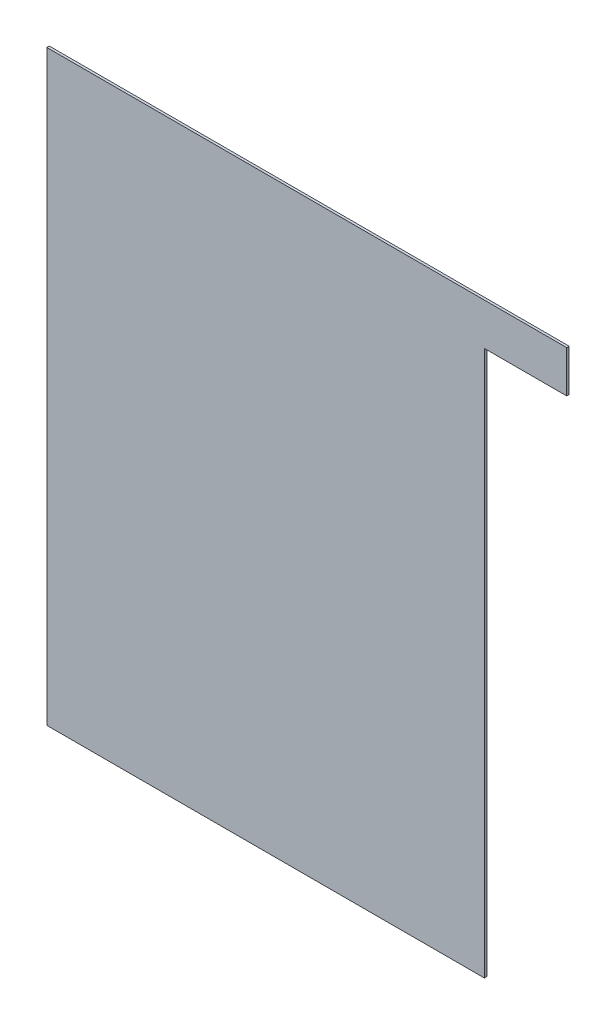
ISO-10303-21;
HEADER;
FILE_DESCRIPTION(('STEP AP214'),'2;1');
FILE_NAME('part.step','',(''),(''),'','','');
FILE_SCHEMA(('AUTOMOTIVE_DESIGN { 1 0 10303 214 1 1 1 1 }'));
ENDSEC;
DATA;
#1=APPLICATION_CONTEXT('core data for automotive mechanical design processes');
#2=APPLICATION_PROTOCOL_DEFINITION('international standard','automotive_design',2000,#1);
#3=PRODUCT_CONTEXT('',#1,'mechanical');
#4=PRODUCT('Part','Part','',(#3));
#5=PRODUCT_RELATED_PRODUCT_CATEGORY('part','',(#4));
#6=PRODUCT_DEFINITION_FORMATION('','',#4);
#7=PRODUCT_DEFINITION_CONTEXT('part definition',#1,'design');
#8=PRODUCT_DEFINITION('design','',#6,#7);
#9=PRODUCT_DEFINITION_SHAPE('','',#8);
#10=(LENGTH_UNIT() NAMED_UNIT(*) SI_UNIT(.MILLI.,.METRE.));
#11=(NAMED_UNIT(*) PLANE_ANGLE_UNIT() SI_UNIT($,.RADIAN.));
#12=(NAMED_UNIT(*) SI_UNIT($,.STERADIAN.) SOLID_ANGLE_UNIT());
#13=UNCERTAINTY_MEASURE_WITH_UNIT(LENGTH_MEASURE(1.E-05),#10,'distance_accuracy_value','');
#14=(GEOMETRIC_REPRESENTATION_CONTEXT(3) GLOBAL_UNCERTAINTY_ASSIGNED_CONTEXT((#13)) GLOBAL_UNIT_ASSIGNED_CONTEXT((#10,
#11,#12)) REPRESENTATION_CONTEXT('',''));
#15=CARTESIAN_POINT('',(0.,0.,0.));
#16=DIRECTION('',(0.,0.,1.));
#17=DIRECTION('',(1.,0.,0.));
#18=AXIS2_PLACEMENT_3D('',#15,#16,#17);
#19=CARTESIAN_POINT('',(0.,0.,2.));
#20=DIRECTION('',(0.,0.,1.));
#21=DIRECTION('',(1.,0.,0.));
#22=AXIS2_PLACEMENT_3D('',#19,#20,#21);
#23=PLANE('',#22);
#24=DIRECTION('',(0.,1.,0.));
#25=VECTOR('',#24,1.);
#26=CARTESIAN_POINT('',(890.,297.7,2.00000000000011));
#27=LINE('',#26,#25);
#28=CARTESIAN_POINT('',(890.,348.5,2.00000000000006));
#29=VERTEX_POINT('',#28);
#30=CARTESIAN_POINT('',(890.,297.7,2.00000000000006));
#31=VERTEX_POINT('',#30);
#32=EDGE_CURVE('E92',#29,#31,#27,.F.);
#33=ORIENTED_EDGE('',*,*,#32,.T.);
#34=DIRECTION('',(-1.,0.,0.));
#35=VECTOR('',#34,1.);
#36=CARTESIAN_POINT('',(790.,297.7,2.00000000000011));
#37=LINE('',#36,#35);
#38=CARTESIAN_POINT('',(790.,297.7,2.00000000000003));
#39=VERTEX_POINT('',#38);
#40=EDGE_CURVE('E68',#31,#39,#37,.T.);
#41=ORIENTED_EDGE('',*,*,#40,.T.);
#42=DIRECTION('',(0.,1.,0.));
#43=VECTOR('',#42,1.);
#44=CARTESIAN_POINT('',(790.,338.5,2.));
#45=LINE('',#44,#43);
#46=CARTESIAN_POINT('',(790.,-364.,2.));
#47=VERTEX_POINT('',#46);
#48=EDGE_CURVE('E80',#47,#39,#45,.T.);
#49=ORIENTED_EDGE('',*,*,#48,.F.);
#50=DIRECTION('',(1.,0.,0.));
#51=VECTOR('',#50,1.);
#52=CARTESIAN_POINT('',(780.,-364.,2.));
#53=LINE('',#52,#51);
#54=CARTESIAN_POINT('',(259.,-364.,2.));
#55=VERTEX_POINT('',#54);
#56=EDGE_CURVE('E20',#55,#47,#53,.T.);
#57=ORIENTED_EDGE('',*,*,#56,.F.);
#58=DIRECTION('',(0.,1.,0.));
#59=VECTOR('',#58,1.);
#60=CARTESIAN_POINT('',(259.,-354.,2.));
#61=LINE('',#60,#59);
#62=CARTESIAN_POINT('',(259.,348.5,2.00000000000003));
#63=VERTEX_POINT('',#62);
#64=EDGE_CURVE('E101',#63,#55,#61,.F.);
#65=ORIENTED_EDGE('',*,*,#64,.F.);
#66=DIRECTION('',(-1.,0.,0.));
#67=VECTOR('',#66,1.);
#68=CARTESIAN_POINT('',(269.,348.5,2.00000000000011));
#69=LINE('',#68,#67);
#70=EDGE_CURVE('E96',#29,#63,#69,.T.);
#71=ORIENTED_EDGE('',*,*,#70,.F.);
#72=EDGE_LOOP('',(#33,#41,#49,#57,#65,#71));
#73=FACE_BOUND('',#72,.T.);
#74=ADVANCED_FACE('F17',(#73),#23,.F.);
#75=CARTESIAN_POINT('',(780.,-364.,2.02800000000047));
#76=DIRECTION('',(0.,-1.,0.));
#77=DIRECTION('',(1.,0.,0.));
#78=AXIS2_PLACEMENT_3D('',#75,#76,#77);
#79=PLANE('',#78);
#80=DIRECTION('',(1.,0.,0.));
#81=VECTOR('',#80,1.);
#82=CARTESIAN_POINT('',(0.,-364.,5.));
#83=LINE('',#82,#81);
#84=CARTESIAN_POINT('',(259.,-364.,5.));
#85=VERTEX_POINT('',#84);
#86=CARTESIAN_POINT('',(790.,-364.,5.));
#87=VERTEX_POINT('',#86);
#88=EDGE_CURVE('E105',#85,#87,#83,.T.);
#89=ORIENTED_EDGE('',*,*,#88,.F.);
#90=DIRECTION('',(0.,0.,1.));
#91=VECTOR('',#90,1.);
#92=CARTESIAN_POINT('',(259.,-364.,2.02800000000036));
#93=LINE('',#92,#91);
#94=EDGE_CURVE('E78',#55,#85,#93,.T.);
#95=ORIENTED_EDGE('',*,*,#94,.F.);
#96=ORIENTED_EDGE('',*,*,#56,.T.);
#97=DIRECTION('',(0.,0.,-1.));
#98=VECTOR('',#97,1.);
#99=CARTESIAN_POINT('',(790.,-364.,2.02800000000048));
#100=LINE('',#99,#98);
#101=EDGE_CURVE('E75',#87,#47,#100,.T.);
#102=ORIENTED_EDGE('',*,*,#101,.F.);
#103=EDGE_LOOP('',(#89,#95,#96,#102));
#104=FACE_BOUND('',#103,.T.);
#105=ADVANCED_FACE('F73',(#104),#79,.T.);
#106=CARTESIAN_POINT('',(790.,338.5,2.02800000000048));
#107=DIRECTION('',(1.,0.,0.));
#108=DIRECTION('',(0.,0.,-1.));
#109=AXIS2_PLACEMENT_3D('',#106,#107,#108);
#110=PLANE('',#109);
#111=ORIENTED_EDGE('',*,*,#101,.T.);
#112=ORIENTED_EDGE('',*,*,#48,.T.);
#113=DIRECTION('',(0.,0.,1.));
#114=VECTOR('',#113,1.);
#115=CARTESIAN_POINT('',(790.,297.7,2.00000000000011));
#116=LINE('',#115,#114);
#117=CARTESIAN_POINT('',(790.,297.7,5.));
#118=VERTEX_POINT('',#117);
#119=EDGE_CURVE('E90',#39,#118,#116,.T.);
#120=ORIENTED_EDGE('',*,*,#119,.T.);
#121=DIRECTION('',(0.,1.,0.));
#122=VECTOR('',#121,1.);
#123=CARTESIAN_POINT('',(790.,0.,5.));
#124=LINE('',#123,#122);
#125=EDGE_CURVE('E86',#87,#118,#124,.T.);
#126=ORIENTED_EDGE('',*,*,#125,.F.);
#127=EDGE_LOOP('',(#111,#112,#120,#126));
#128=FACE_BOUND('',#127,.T.);
#129=ADVANCED_FACE('F84',(#128),#110,.T.);
#130=CARTESIAN_POINT('',(790.,297.7,2.00000000000011));
#131=DIRECTION('',(0.,1.,0.));
#132=DIRECTION('',(-1.,0.,0.));
#133=AXIS2_PLACEMENT_3D('',#130,#131,#132);
#134=PLANE('',#133);
#135=DIRECTION('',(1.,0.,0.));
#136=VECTOR('',#135,1.);
#137=CARTESIAN_POINT('',(0.,297.7,5.));
#138=LINE('',#137,#136);
#139=CARTESIAN_POINT('',(890.,297.7,5.));
#140=VERTEX_POINT('',#139);
#141=EDGE_CURVE('E108',#118,#140,#138,.T.);
#142=ORIENTED_EDGE('',*,*,#141,.F.);
#143=ORIENTED_EDGE('',*,*,#119,.F.);
#144=ORIENTED_EDGE('',*,*,#40,.F.);
#145=DIRECTION('',(0.,0.,1.));
#146=VECTOR('',#145,1.);
#147=CARTESIAN_POINT('',(890.,297.7,2.00000000000011));
#148=LINE('',#147,#146);
#149=EDGE_CURVE('E94',#31,#140,#148,.T.);
#150=ORIENTED_EDGE('',*,*,#149,.T.);
#151=EDGE_LOOP('',(#142,#143,#144,#150));
#152=FACE_BOUND('',#151,.T.);
#153=ADVANCED_FACE('F125',(#152),#134,.F.);
#154=CARTESIAN_POINT('',(890.,297.7,2.00000000000011));
#155=DIRECTION('',(-1.,0.,0.));
#156=DIRECTION('',(0.,0.,1.));
#157=AXIS2_PLACEMENT_3D('',#154,#155,#156);
#158=PLANE('',#157);
#159=DIRECTION('',(0.,1.,0.));
#160=VECTOR('',#159,1.);
#161=CARTESIAN_POINT('',(890.,0.,5.));
#162=LINE('',#161,#160);
#163=CARTESIAN_POINT('',(890.,348.5,5.));
#164=VERTEX_POINT('',#163);
#165=EDGE_CURVE('E111',#140,#164,#162,.T.);
#166=ORIENTED_EDGE('',*,*,#165,.F.);
#167=ORIENTED_EDGE('',*,*,#149,.F.);
#168=ORIENTED_EDGE('',*,*,#32,.F.);
#169=DIRECTION('',(0.,0.,1.));
#170=VECTOR('',#169,1.);
#171=CARTESIAN_POINT('',(890.,348.5,2.02800000000036));
#172=LINE('',#171,#170);
#173=EDGE_CURVE('E98',#164,#29,#172,.F.);
#174=ORIENTED_EDGE('',*,*,#173,.F.);
#175=EDGE_LOOP('',(#166,#167,#168,#174));
#176=FACE_BOUND('',#175,.T.);
#177=ADVANCED_FACE('F121',(#176),#158,.F.);
#178=CARTESIAN_POINT('',(269.,348.5,2.02800000000036));
#179=DIRECTION('',(0.,1.,0.));
#180=DIRECTION('',(-1.,0.,0.));
#181=AXIS2_PLACEMENT_3D('',#178,#179,#180);
#182=PLANE('',#181);
#183=DIRECTION('',(1.,0.,0.));
#184=VECTOR('',#183,1.);
#185=CARTESIAN_POINT('',(0.,348.5,5.));
#186=LINE('',#185,#184);
#187=CARTESIAN_POINT('',(259.,348.5,5.));
#188=VERTEX_POINT('',#187);
#189=EDGE_CURVE('E26',#164,#188,#186,.F.);
#190=ORIENTED_EDGE('',*,*,#189,.F.);
#191=ORIENTED_EDGE('',*,*,#173,.T.);
#192=ORIENTED_EDGE('',*,*,#70,.T.);
#193=DIRECTION('',(0.,0.,1.));
#194=VECTOR('',#193,1.);
#195=CARTESIAN_POINT('',(259.,348.5,2.02800000000036));
#196=LINE('',#195,#194);
#197=EDGE_CURVE('E35',#188,#63,#196,.F.);
#198=ORIENTED_EDGE('',*,*,#197,.F.);
#199=EDGE_LOOP('',(#190,#191,#192,#198));
#200=FACE_BOUND('',#199,.T.);
#201=ADVANCED_FACE('F118',(#200),#182,.T.);
#202=CARTESIAN_POINT('',(259.,-354.,2.02800000000036));
#203=DIRECTION('',(-1.,0.,0.));
#204=DIRECTION('',(0.,0.,1.));
#205=AXIS2_PLACEMENT_3D('',#202,#203,#204);
#206=PLANE('',#205);
#207=DIRECTION('',(0.,1.,0.));
#208=VECTOR('',#207,1.);
#209=CARTESIAN_POINT('',(259.,0.,5.));
#210=LINE('',#209,#208);
#211=EDGE_CURVE('E11',#188,#85,#210,.F.);
#212=ORIENTED_EDGE('',*,*,#211,.F.);
#213=ORIENTED_EDGE('',*,*,#197,.T.);
#214=ORIENTED_EDGE('',*,*,#64,.T.);
#215=ORIENTED_EDGE('',*,*,#94,.T.);
#216=EDGE_LOOP('',(#212,#213,#214,#215));
#217=FACE_BOUND('',#216,.T.);
#218=ADVANCED_FACE('F127',(#217),#206,.T.);
#219=CARTESIAN_POINT('',(0.,0.,5.));
#220=DIRECTION('',(0.,0.,1.));
#221=DIRECTION('',(1.,0.,0.));
#222=AXIS2_PLACEMENT_3D('',#219,#220,#221);
#223=PLANE('',#222);
#224=ORIENTED_EDGE('',*,*,#189,.T.);
#225=ORIENTED_EDGE('',*,*,#211,.T.);
#226=ORIENTED_EDGE('',*,*,#88,.T.);
#227=ORIENTED_EDGE('',*,*,#125,.T.);
#228=ORIENTED_EDGE('',*,*,#141,.T.);
#229=ORIENTED_EDGE('',*,*,#165,.T.);
#230=EDGE_LOOP('',(#224,#225,#226,#227,#228,#229));
#231=FACE_BOUND('',#230,.T.);
#232=ADVANCED_FACE('F116',(#231),#223,.T.);
#233=CLOSED_SHELL('',(#74,#105,#129,#153,#177,#201,#218,#232));
#234=MANIFOLD_SOLID_BREP('B1',#233);
#235=ADVANCED_BREP_SHAPE_REPRESENTATION('',(#18,#234),#14);
#236=SHAPE_DEFINITION_REPRESENTATION(#9,#235);
ENDSEC;
END-ISO-10303-21;
